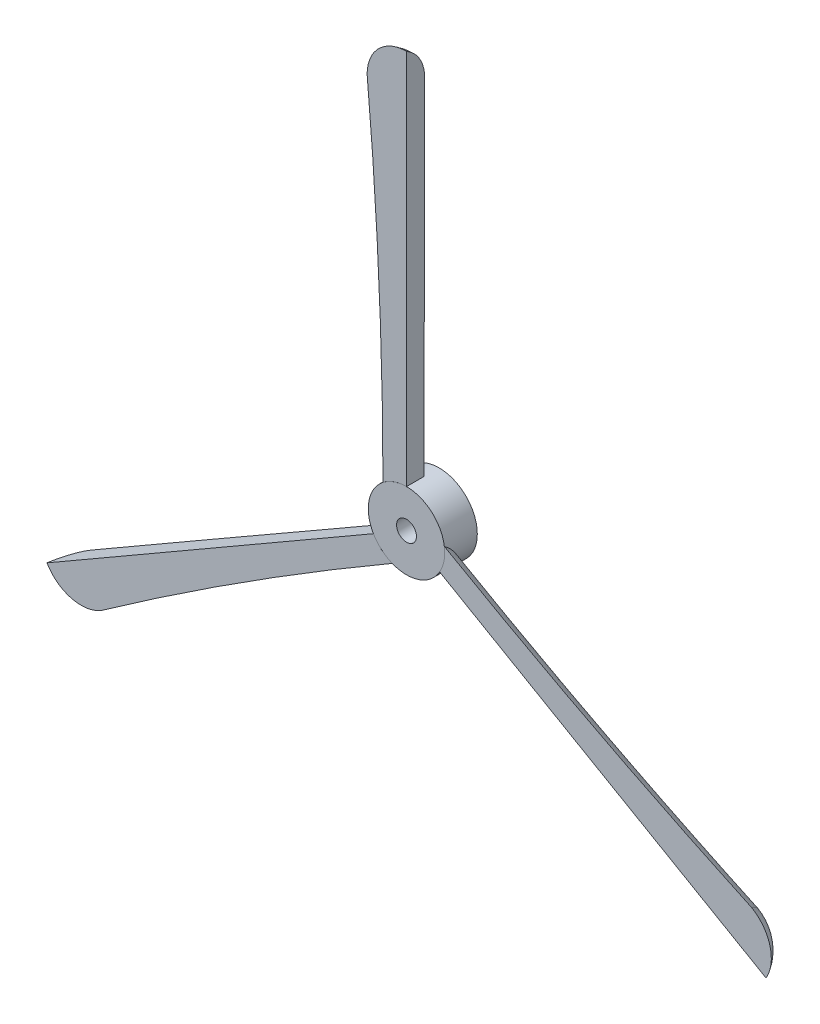
ISO-10303-21;
HEADER;
FILE_DESCRIPTION(('STEP AP214'),'2;1');
FILE_NAME('part.step','',(''),(''),'','','');
FILE_SCHEMA(('AUTOMOTIVE_DESIGN { 1 0 10303 214 1 1 1 1 }'));
ENDSEC;
DATA;
#1=APPLICATION_CONTEXT('core data for automotive mechanical design processes');
#2=APPLICATION_PROTOCOL_DEFINITION('international standard','automotive_design',2000,#1);
#3=PRODUCT_CONTEXT('',#1,'mechanical');
#4=PRODUCT('Part','Part','',(#3));
#5=PRODUCT_RELATED_PRODUCT_CATEGORY('part','',(#4));
#6=PRODUCT_DEFINITION_FORMATION('','',#4);
#7=PRODUCT_DEFINITION_CONTEXT('part definition',#1,'design');
#8=PRODUCT_DEFINITION('design','',#6,#7);
#9=PRODUCT_DEFINITION_SHAPE('','',#8);
#10=(LENGTH_UNIT() NAMED_UNIT(*) SI_UNIT(.MILLI.,.METRE.));
#11=(NAMED_UNIT(*) PLANE_ANGLE_UNIT() SI_UNIT($,.RADIAN.));
#12=(NAMED_UNIT(*) SI_UNIT($,.STERADIAN.) SOLID_ANGLE_UNIT());
#13=UNCERTAINTY_MEASURE_WITH_UNIT(LENGTH_MEASURE(1.E-05),#10,'distance_accuracy_value','');
#14=(GEOMETRIC_REPRESENTATION_CONTEXT(3) GLOBAL_UNCERTAINTY_ASSIGNED_CONTEXT((#13)) GLOBAL_UNIT_ASSIGNED_CONTEXT((#10,
#11,#12)) REPRESENTATION_CONTEXT('',''));
#15=CARTESIAN_POINT('',(0.,0.,0.));
#16=DIRECTION('',(0.,0.,1.));
#17=DIRECTION('',(1.,0.,0.));
#18=AXIS2_PLACEMENT_3D('',#15,#16,#17);
#19=CARTESIAN_POINT('',(0.,0.,4.));
#20=DIRECTION('',(-0.499999999999992,-0.866025403784443,0.));
#21=DIRECTION('',(0.,0.,-1.));
#22=AXIS2_PLACEMENT_3D('',#19,#20,#21);
#23=PLANE('',#22);
#24=DIRECTION('',(0.866025403784443,-0.499999999999992,0.));
#25=VECTOR('',#24,1.);
#26=CARTESIAN_POINT('',(0.,0.,4.));
#27=LINE('',#26,#25);
#28=CARTESIAN_POINT('',(65.1523569172659,-37.6157308045212,4.));
#29=VERTEX_POINT('',#28);
#30=CARTESIAN_POINT('',(91.8764150842648,-53.044872981077,4.));
#31=VERTEX_POINT('',#30);
#32=EDGE_CURVE('E118',#29,#31,#27,.T.);
#33=ORIENTED_EDGE('',*,*,#32,.T.);
#34=CARTESIAN_POINT('',(91.8764150842648,-53.044872981077,14.));
#35=DIRECTION('',(-0.499999999999992,-0.866025403784443,0.));
#36=DIRECTION('',(0.,0.,-1.));
#37=AXIS2_PLACEMENT_3D('',#34,#35,#36);
#38=CIRCLE('',#37,10.);
#39=CARTESIAN_POINT('',(99.3764150842649,-57.3749999999991,9.));
#40=VERTEX_POINT('',#39);
#41=EDGE_CURVE('E66',#31,#40,#38,.T.);
#42=ORIENTED_EDGE('',*,*,#41,.T.);
#43=DIRECTION('',(0.866025403784443,-0.499999999999992,0.));
#44=VECTOR('',#43,1.);
#45=CARTESIAN_POINT('',(0.,0.,9.));
#46=LINE('',#45,#44);
#47=CARTESIAN_POINT('',(9.152088272062,-5.2839606275221,9.));
#48=VERTEX_POINT('',#47);
#49=EDGE_CURVE('E115',#48,#40,#46,.T.);
#50=ORIENTED_EDGE('',*,*,#49,.F.);
#51=DIRECTION('',(0.,0.,1.));
#52=VECTOR('',#51,1.);
#53=CARTESIAN_POINT('',(9.152088272062,-5.2839606275221,4.));
#54=LINE('',#53,#52);
#55=CARTESIAN_POINT('',(9.152088272062,-5.2839606275221,4.23324208766593));
#56=VERTEX_POINT('',#55);
#57=EDGE_CURVE('E122',#56,#48,#54,.T.);
#58=ORIENTED_EDGE('',*,*,#57,.F.);
#59=CARTESIAN_POINT('',(9.152088272062,-5.2839606275221,4.23324208766593));
#60=CARTESIAN_POINT('',(10.5954674638761,-6.11729599245863,4.23208812665062));
#61=CARTESIAN_POINT('',(12.0388460357292,-6.95063099946055,4.2300670543315));
#62=CARTESIAN_POINT('',(14.9256004868418,-8.61729945889474,4.224403935678));
#63=CARTESIAN_POINT('',(16.3689763661018,-9.45063291132732,4.22076188970693));
#64=CARTESIAN_POINT('',(19.2557241084424,-11.1172974974502,4.21197007330051));
#65=CARTESIAN_POINT('',(20.6990959715242,-11.9506286311411,4.20682030340619));
#66=CARTESIAN_POINT('',(23.5858357084713,-13.6172885953479,4.19520280566006));
#67=CARTESIAN_POINT('',(25.0292035823366,-14.4506174258637,4.18873507779009));
#68=CARTESIAN_POINT('',(29.6958788689917,-17.1449236588345,4.16605265027741));
#69=CARTESIAN_POINT('',(32.9191781191645,-19.0058963486005,4.14765392579095));
#70=CARTESIAN_POINT('',(39.3657671703066,-22.7278362726322,4.10895883369531));
#71=CARTESIAN_POINT('',(42.5890569712764,-24.5888035068982,4.08866246621143));
#72=CARTESIAN_POINT('',(47.4240076257717,-27.3802635687895,4.06047666230288));
#73=CARTESIAN_POINT('',(49.0356633019366,-28.3107534072643,4.05145783851708));
#74=CARTESIAN_POINT('',(52.2589798721828,-30.1717360967793,4.03491249033853));
#75=CARTESIAN_POINT('',(53.8706407662617,-31.1022289478181,4.02738596535778));
#76=CARTESIAN_POINT('',(57.0939735059386,-32.9632209727583,4.01461681336839));
#77=CARTESIAN_POINT('',(58.7056453515532,-33.8937201466692,4.0093741915727));
#78=CARTESIAN_POINT('',(61.9289965869679,-35.7547228501286,4.00207350693363));
#79=CARTESIAN_POINT('',(63.5406759767756,-36.6852263796814,4.00001544874754));
#80=CARTESIAN_POINT('',(65.1523569172659,-37.6157308045213,4.));
#81=B_SPLINE_CURVE_WITH_KNOTS('',3,(#59,#60,#61,#62,#63,#64,#65,#66,#67,#68,#69,#70,#71,#72,#73,
#74,#75,#76,#77,#78,#79,#80),.UNSPECIFIED.,.F.,.F.,(4,2,2,2,2,2,2,2,2,2,4),(0.,5.00001299800278,
10.0000248753014,15.0000349583489,20.0000451102266,31.1660154591632,42.3319850707985,
47.9149892699279,53.4979912691934,59.0810060114387,64.6640289186212),.UNSPECIFIED.);
#82=EDGE_CURVE('E126',#56,#29,#81,.T.);
#83=ORIENTED_EDGE('',*,*,#82,.T.);
#84=EDGE_LOOP('',(#33,#42,#50,#58,#83));
#85=FACE_BOUND('',#84,.T.);
#86=ADVANCED_FACE('F52',(#85),#23,.T.);
#87=CARTESIAN_POINT('',(0.,0.,4.));
#88=DIRECTION('',(0.,0.,1.));
#89=DIRECTION('',(-0.499999999999992,-0.866025403784443,0.));
#90=AXIS2_PLACEMENT_3D('',#87,#88,#89);
#91=CYLINDRICAL_SURFACE('',#90,10.5679212550444);
#92=CARTESIAN_POINT('',(0.,0.,9.));
#93=DIRECTION('',(0.,0.,1.));
#94=DIRECTION('',(-0.499999999999992,-0.866025403784443,0.));
#95=AXIS2_PLACEMENT_3D('',#92,#93,#94);
#96=CIRCLE('',#95,10.5679212550444);
#97=CARTESIAN_POINT('',(10.4647183992984,1.47330528954556,9.));
#98=VERTEX_POINT('',#97);
#99=EDGE_CURVE('E110',#48,#98,#96,.T.);
#100=ORIENTED_EDGE('',*,*,#99,.T.);
#101=CARTESIAN_POINT('',(10.4647183992984,1.47330528954556,9.));
#102=CARTESIAN_POINT('',(10.4772068265116,1.38461057903331,8.87767671407899));
#103=CARTESIAN_POINT('',(10.4888786306254,1.29352827575395,8.75702498326268));
#104=CARTESIAN_POINT('',(10.5102177319619,1.1068447304787,8.51908646485478));
#105=CARTESIAN_POINT('',(10.5198850259529,1.01124348119761,8.40179968268847));
#106=CARTESIAN_POINT('',(10.545333905741,0.717922648063707,8.05487404754202));
#107=CARTESIAN_POINT('',(10.5575457708955,0.513798683854439,7.83032451242971));
#108=CARTESIAN_POINT('',(10.5697164102885,0.0883942893414073,7.39336570220923));
#109=CARTESIAN_POINT('',(10.5695511458919,-0.13303759287408,7.18110066608649));
#110=CARTESIAN_POINT('',(10.5539430689205,-0.589340995017446,6.7722349673859));
#111=CARTESIAN_POINT('',(10.5385062286497,-0.824207227301471,6.57562821374987));
#112=CARTESIAN_POINT('',(10.4940428567885,-1.26325742614638,6.23243674624884));
#113=CARTESIAN_POINT('',(10.4678728377253,-1.46560290277407,6.08312477687204));
#114=CARTESIAN_POINT('',(10.4019953573406,-1.87691712432631,5.79705696001114));
#115=CARTESIAN_POINT('',(10.3622876193428,-2.08588600453707,5.66030136921972));
#116=CARTESIAN_POINT('',(10.2683365102039,-2.50771696402272,5.40127423499538));
#117=CARTESIAN_POINT('',(10.214180750162,-2.72054860041248,5.27892159432284));
#118=CARTESIAN_POINT('',(10.0901408235776,-3.14957610607928,5.04900962458501));
#119=CARTESIAN_POINT('',(10.0202617558803,-3.3657708636344,4.94144551798515));
#120=CARTESIAN_POINT('',(9.89098124313928,-3.72454386502421,4.77675216628645));
#121=CARTESIAN_POINT('',(9.83630326876818,-3.86674536853299,4.71503889959368));
#122=CARTESIAN_POINT('',(9.71972172122324,-4.15109256986937,4.59880000559343));
#123=CARTESIAN_POINT('',(9.65782007292833,-4.29323827248241,4.54427247172583));
#124=CARTESIAN_POINT('',(9.52630631954748,-4.57767677653495,4.44239111132145));
#125=CARTESIAN_POINT('',(9.45665038163282,-4.71996538825645,4.3950820637944));
#126=CARTESIAN_POINT('',(9.30992149788299,-5.00318320591918,4.30825020040899));
#127=CARTESIAN_POINT('',(9.23284475674628,-5.14411167525451,4.26873140062563));
#128=CARTESIAN_POINT('',(9.15208827206201,-5.28396062752207,4.23324208766587));
#129=B_SPLINE_CURVE_WITH_KNOTS('',3,(#101,#102,#103,#104,#105,#106,#107,#108,#109,#110,#111,
#112,#113,#114,#115,#116,#117,#118,#119,#120,#121,#122,#123,#124,#125,#126,#127,#128),
.UNSPECIFIED.,.F.,.F.,(4,2,2,2,2,2,2,2,2,2,2,2,2,4),(0.,0.454764260886536,0.909529254945333,
1.81963381048955,2.73886027805805,3.65772740284461,4.41552369004862,5.17333546559458,
5.92665248430483,6.67972556419344,7.17257191329865,7.66528723315118,8.16094460288619,
8.65685683243503),.UNSPECIFIED.);
#130=EDGE_CURVE('E12',#98,#56,#129,.T.);
#131=ORIENTED_EDGE('',*,*,#130,.T.);
#132=ORIENTED_EDGE('',*,*,#57,.T.);
#133=EDGE_LOOP('',(#100,#131,#132));
#134=FACE_BOUND('',#133,.T.);
#135=ADVANCED_FACE('F138',(#134),#91,.F.);
#136=CARTESIAN_POINT('',(0.,0.,4.));
#137=DIRECTION('',(0.,0.,1.));
#138=DIRECTION('',(-0.499999999999992,-0.866025403784443,0.));
#139=AXIS2_PLACEMENT_3D('',#136,#137,#138);
#140=PLANE('',#139);
#141=CARTESIAN_POINT('',(543.942700327921,927.833916149742,4.));
#142=DIRECTION('',(0.,0.,1.));
#143=DIRECTION('',(-0.499999999999992,-0.866025403784443,0.));
#144=AXIS2_PLACEMENT_3D('',#141,#142,#143);
#145=CIRCLE('',#144,1077.65171263605);
#146=CARTESIAN_POINT('',(91.2612271282953,-50.1296299853994,4.));
#147=VERTEX_POINT('',#146);
#148=EDGE_CURVE('E79',#29,#147,#145,.T.);
#149=ORIENTED_EDGE('',*,*,#148,.T.);
#150=CARTESIAN_POINT('',(89.9451873513345,-51.9298781296032,4.));
#151=DIRECTION('',(0.,0.,1.));
#152=DIRECTION('',(-0.499999999999992,-0.866025403784443,0.));
#153=AXIS2_PLACEMENT_3D('',#150,#151,#152);
#154=CIRCLE('',#153,2.22998970294755);
#155=EDGE_CURVE('E102',#147,#31,#154,.F.);
#156=ORIENTED_EDGE('',*,*,#155,.T.);
#157=ORIENTED_EDGE('',*,*,#32,.F.);
#158=EDGE_LOOP('',(#149,#156,#157));
#159=FACE_BOUND('',#158,.T.);
#160=ADVANCED_FACE('F147',(#159),#140,.F.);
#161=CARTESIAN_POINT('',(0.,0.,9.));
#162=DIRECTION('',(0.,0.,1.));
#163=DIRECTION('',(-0.499999999999992,-0.866025403784443,0.));
#164=AXIS2_PLACEMENT_3D('',#161,#162,#163);
#165=PLANE('',#164);
#166=CARTESIAN_POINT('',(89.9451873513345,-51.9298781296032,9.));
#167=DIRECTION('',(0.,0.,1.));
#168=DIRECTION('',(-0.499999999999992,-0.866025403784443,0.));
#169=AXIS2_PLACEMENT_3D('',#166,#167,#168);
#170=CIRCLE('',#169,10.8902437407919);
#171=CARTESIAN_POINT('',(95.3822148700475,-42.4939817495757,9.));
#172=VERTEX_POINT('',#171);
#173=EDGE_CURVE('E101',#40,#172,#170,.T.);
#174=ORIENTED_EDGE('',*,*,#173,.T.);
#175=CARTESIAN_POINT('',(543.942700327921,927.833916149742,9.));
#176=DIRECTION('',(0.,0.,1.));
#177=DIRECTION('',(-0.499999999999992,-0.866025403784443,0.));
#178=AXIS2_PLACEMENT_3D('',#175,#176,#177);
#179=CIRCLE('',#178,1068.9914585982);
#180=EDGE_CURVE('E105',#172,#98,#179,.F.);
#181=ORIENTED_EDGE('',*,*,#180,.T.);
#182=ORIENTED_EDGE('',*,*,#99,.F.);
#183=ORIENTED_EDGE('',*,*,#49,.T.);
#184=EDGE_LOOP('',(#174,#181,#182,#183));
#185=FACE_BOUND('',#184,.T.);
#186=ADVANCED_FACE('F113',(#185),#165,.T.);
#187=CARTESIAN_POINT('',(543.942700327921,927.833916149742,14.));
#188=DIRECTION('',(0.,0.,1.));
#189=DIRECTION('',(-0.499999999999992,-0.866025403784443,0.));
#190=AXIS2_PLACEMENT_3D('',#187,#188,#189);
#191=TOROIDAL_SURFACE('',#190,1077.65171263605,10.);
#192=ORIENTED_EDGE('',*,*,#130,.F.);
#193=ORIENTED_EDGE('',*,*,#180,.F.);
#194=CARTESIAN_POINT('',(95.3822148700475,-42.4939817495757,9.));
#195=CARTESIAN_POINT('',(95.3108989938501,-42.6316718739632,8.73160289977827));
#196=CARTESIAN_POINT('',(95.2337472046003,-42.7804808934664,8.47047025119086));
#197=CARTESIAN_POINT('',(95.0684205546519,-43.098855562409,7.96487110722592));
#198=CARTESIAN_POINT('',(94.9802454849489,-43.268421605406,7.72040492798515));
#199=CARTESIAN_POINT('',(94.7937527033861,-43.6263844257354,7.25086267925941));
#200=CARTESIAN_POINT('',(94.6954603913925,-43.814734010676,7.02574053507794));
#201=CARTESIAN_POINT('',(94.4892951693264,-44.2088960337502,6.59615939917471));
#202=CARTESIAN_POINT('',(94.3814234395505,-44.4147063203813,6.39169786844127));
#203=CARTESIAN_POINT('',(94.1670997532954,-44.8224994529995,6.02276126640526));
#204=CARTESIAN_POINT('',(94.0614110964438,-45.023127733907,5.85634069349968));
#205=CARTESIAN_POINT('',(93.8433763078975,-45.4357969442956,5.5431676911415));
#206=CARTESIAN_POINT('',(93.7310302823332,-45.6478376918364,5.3964149482699));
#207=CARTESIAN_POINT('',(93.5002527837902,-46.081851840821,5.12353905664158));
#208=CARTESIAN_POINT('',(93.3818179871453,-46.3038306584162,4.99742733571265));
#209=CARTESIAN_POINT('',(93.1395582861941,-46.7559132462422,4.76681889462885));
#210=CARTESIAN_POINT('',(93.0157335951233,-46.9860166949777,4.66232132031242));
#211=CARTESIAN_POINT('',(92.7638638202652,-47.4515281916737,4.47607954936247));
#212=CARTESIAN_POINT('',(92.6358400261391,-47.6869079989688,4.39423593637854));
#213=CARTESIAN_POINT('',(92.3755911154198,-48.1620943948559,4.2532457231008));
#214=CARTESIAN_POINT('',(92.2433661699109,-48.4019008030162,4.19409819982827));
#215=CARTESIAN_POINT('',(91.9754399068468,-48.8833614051491,4.09899800408775));
#216=CARTESIAN_POINT('',(91.8397476581782,-49.1250098094164,4.06299020547932));
#217=CARTESIAN_POINT('',(91.5647637592324,-49.6084547191805,4.01417377933688));
#218=CARTESIAN_POINT('',(91.4254747808844,-49.8502509914629,4.00134840597009));
#219=CARTESIAN_POINT('',(91.2764897847047,-50.1037073052,4.00003355594432));
#220=CARTESIAN_POINT('',(91.2688614888627,-50.1166706605125,3.99999994728489));
#221=CARTESIAN_POINT('',(91.2612271282953,-50.1296299853994,4.));
#222=B_SPLINE_CURVE_WITH_KNOTS('',3,(#194,#195,#196,#197,#198,#199,#200,#201,#202,#203,#204,
#205,#206,#207,#208,#209,#210,#211,#212,#213,#214,#215,#216,#217,#218,#219,#220,#221),
.UNSPECIFIED.,.F.,.F.,(4,2,2,2,2,2,2,2,2,2,2,2,2,4),(0.,0.929565317697032,1.859148262886,
2.7864518731275,3.71364138678522,4.55649671955107,5.39933861930026,6.24264558842751,
7.08591922484495,7.92543128465569,8.76490920052776,9.60237972716184,10.4392450645515,
10.4843687744743),.UNSPECIFIED.);
#223=EDGE_CURVE('E57',#147,#172,#222,.F.);
#224=ORIENTED_EDGE('',*,*,#223,.F.);
#225=ORIENTED_EDGE('',*,*,#148,.F.);
#226=ORIENTED_EDGE('',*,*,#82,.F.);
#227=EDGE_LOOP('',(#192,#193,#224,#225,#226));
#228=FACE_BOUND('',#227,.T.);
#229=ADVANCED_FACE('F106',(#228),#191,.T.);
#230=CARTESIAN_POINT('',(89.9451873513345,-51.9298781296032,14.));
#231=DIRECTION('',(0.,0.,-1.));
#232=DIRECTION('',(0.499999999999992,0.866025403784443,0.));
#233=AXIS2_PLACEMENT_3D('',#230,#231,#232);
#234=DEGENERATE_TOROIDAL_SURFACE('',#233,2.22998970294755,10.,.T.);
#235=ORIENTED_EDGE('',*,*,#41,.F.);
#236=ORIENTED_EDGE('',*,*,#155,.F.);
#237=ORIENTED_EDGE('',*,*,#223,.T.);
#238=ORIENTED_EDGE('',*,*,#173,.F.);
#239=EDGE_LOOP('',(#235,#236,#237,#238));
#240=FACE_BOUND('',#239,.T.);
#241=ADVANCED_FACE('F54',(#240),#234,.T.);
#242=CLOSED_SHELL('',(#86,#135,#160,#186,#229,#241));
#243=MANIFOLD_SOLID_BREP('B2',#242);
#244=CARTESIAN_POINT('',(0.,0.,4.));
#245=DIRECTION('',(-0.500000000000004,0.866025403784436,0.));
#246=DIRECTION('',(0.,0.,-1.));
#247=AXIS2_PLACEMENT_3D('',#244,#245,#246);
#248=PLANE('',#247);
#249=DIRECTION('',(-0.866025403784436,-0.500000000000004,0.));
#250=VECTOR('',#249,1.);
#251=CARTESIAN_POINT('',(0.,0.,4.));
#252=LINE('',#251,#250);
#253=CARTESIAN_POINT('',(-65.1523569172654,-37.6157308045222,4.));
#254=VERTEX_POINT('',#253);
#255=CARTESIAN_POINT('',(-91.8764150842641,-53.0448729810782,4.));
#256=VERTEX_POINT('',#255);
#257=EDGE_CURVE('E261',#254,#256,#252,.T.);
#258=ORIENTED_EDGE('',*,*,#257,.T.);
#259=CARTESIAN_POINT('',(-91.8764150842641,-53.0448729810782,14.));
#260=DIRECTION('',(-0.500000000000004,0.866025403784436,0.));
#261=DIRECTION('',(0.,0.,-1.));
#262=AXIS2_PLACEMENT_3D('',#259,#260,#261);
#263=CIRCLE('',#262,10.);
#264=CARTESIAN_POINT('',(-99.3764150842641,-57.3750000000005,9.));
#265=VERTEX_POINT('',#264);
#266=EDGE_CURVE('E209',#256,#265,#263,.T.);
#267=ORIENTED_EDGE('',*,*,#266,.T.);
#268=DIRECTION('',(-0.866025403784436,-0.500000000000004,0.));
#269=VECTOR('',#268,1.);
#270=CARTESIAN_POINT('',(0.,0.,9.));
#271=LINE('',#270,#269);
#272=CARTESIAN_POINT('',(-9.15208827206192,-5.28396062752222,9.));
#273=VERTEX_POINT('',#272);
#274=EDGE_CURVE('E258',#273,#265,#271,.T.);
#275=ORIENTED_EDGE('',*,*,#274,.F.);
#276=DIRECTION('',(0.,0.,1.));
#277=VECTOR('',#276,1.);
#278=CARTESIAN_POINT('',(-9.15208827206192,-5.28396062752222,4.));
#279=LINE('',#278,#277);
#280=CARTESIAN_POINT('',(-9.15208827206192,-5.28396062752222,4.23324208766593));
#281=VERTEX_POINT('',#280);
#282=EDGE_CURVE('E265',#281,#273,#279,.T.);
#283=ORIENTED_EDGE('',*,*,#282,.F.);
#284=CARTESIAN_POINT('',(-9.15208827206192,-5.28396062752222,4.23324208766593));
#285=CARTESIAN_POINT('',(-10.595467463876,-6.11729599245878,4.23208812665055));
#286=CARTESIAN_POINT('',(-12.0388460357291,-6.95063099946072,4.23006705433144));
#287=CARTESIAN_POINT('',(-14.9256004868417,-8.61729945889495,4.22440393567797));
#288=CARTESIAN_POINT('',(-16.3689763661017,-9.45063291132755,4.22076188970694));
#289=CARTESIAN_POINT('',(-19.2557241084423,-11.1172974974504,4.21197007330051));
#290=CARTESIAN_POINT('',(-20.699095971524,-11.9506286311414,4.20682030340615));
#291=CARTESIAN_POINT('',(-23.5858357084712,-13.6172885953483,4.19520280566001));
#292=CARTESIAN_POINT('',(-25.0292035823364,-14.450617425864,4.18873507779008));
#293=CARTESIAN_POINT('',(-29.6958788689914,-17.1449236588349,4.16605265027744));
#294=CARTESIAN_POINT('',(-32.9191781191643,-19.0058963486009,4.14765392579092));
#295=CARTESIAN_POINT('',(-39.3657671703063,-22.7278362726327,4.10895883369526));
#296=CARTESIAN_POINT('',(-42.5890569712761,-24.5888035068988,4.08866246621144));
#297=CARTESIAN_POINT('',(-47.4240076257713,-27.3802635687902,4.06047666230288));
#298=CARTESIAN_POINT('',(-49.0356633019362,-28.310753407265,4.05145783851706));
#299=CARTESIAN_POINT('',(-52.2589798721823,-30.17173609678,4.03491249033851));
#300=CARTESIAN_POINT('',(-53.8706407662613,-31.1022289478189,4.02738596535777));
#301=CARTESIAN_POINT('',(-57.0939735059381,-32.9632209727591,4.01461681336839));
#302=CARTESIAN_POINT('',(-58.7056453515527,-33.89372014667,4.0093741915727));
#303=CARTESIAN_POINT('',(-61.9289965869674,-35.7547228501294,4.00207350693362));
#304=CARTESIAN_POINT('',(-63.5406759767751,-36.6852263796823,4.00001544874753));
#305=CARTESIAN_POINT('',(-65.1523569172654,-37.6157308045222,4.));
#306=B_SPLINE_CURVE_WITH_KNOTS('',3,(#284,#285,#286,#287,#288,#289,#290,#291,#292,#293,#294,
#295,#296,#297,#298,#299,#300,#301,#302,#303,#304,#305),.UNSPECIFIED.,.F.,.F.,(4,2,2,2,2,2,2,2,
2,2,4),(0.,5.00001299800278,10.0000248753014,15.0000349583489,20.0000451102266,31.1660154591632,
42.3319850707985,47.9149892699279,53.4979912691934,59.0810060114387,64.6640289186212),.UNSPECIFIED.);
#307=EDGE_CURVE('E269',#281,#254,#306,.T.);
#308=ORIENTED_EDGE('',*,*,#307,.T.);
#309=EDGE_LOOP('',(#258,#267,#275,#283,#308));
#310=FACE_BOUND('',#309,.T.);
#311=ADVANCED_FACE('F195',(#310),#248,.T.);
#312=CARTESIAN_POINT('',(0.,0.,4.));
#313=DIRECTION('',(0.,0.,1.));
#314=DIRECTION('',(-0.500000000000004,0.866025403784436,0.));
#315=AXIS2_PLACEMENT_3D('',#312,#313,#314);
#316=CYLINDRICAL_SURFACE('',#315,10.5679212550444);
#317=CARTESIAN_POINT('',(0.,0.,9.));
#318=DIRECTION('',(0.,0.,1.));
#319=DIRECTION('',(-0.500000000000004,0.866025403784436,0.));
#320=AXIS2_PLACEMENT_3D('',#317,#318,#319);
#321=CIRCLE('',#320,10.5679212550444);
#322=CARTESIAN_POINT('',(-3.95643939137282,-9.79936462201565,9.));
#323=VERTEX_POINT('',#322);
#324=EDGE_CURVE('E253',#273,#323,#321,.T.);
#325=ORIENTED_EDGE('',*,*,#324,.T.);
#326=CARTESIAN_POINT('',(-3.95643939137282,-9.79936462201565,9.));
#327=CARTESIAN_POINT('',(-4.03949547746421,-9.76583256197952,8.87767671407887));
#328=CARTESIAN_POINT('',(-4.1242109679962,-9.73039948921037,8.75702498326254));
#329=CARTESIAN_POINT('',(-4.29655321134139,-9.65553792042406,8.51908646485466));
#330=CARTESIAN_POINT('',(-4.38417996884791,-9.61610941796556,8.40179968268839));
#331=CARTESIAN_POINT('',(-4.65092770169518,-9.49148837779295,8.05487404754196));
#332=CARTESIAN_POINT('',(-4.83381017279866,-9.40000218113972,7.83032451242952));
#333=CARTESIAN_POINT('',(-5.20830650502497,-9.1978400667779,7.39336570220902));
#334=CARTESIAN_POINT('',(-5.39998950803319,-9.08698100250431,7.1811006660864));
#335=CARTESIAN_POINT('',(-5.78735580763703,-8.84531231027112,6.77223496738594));
#336=CARTESIAN_POINT('',(-5.98303751115073,-8.71451049830041,6.57562821374992));
#337=CARTESIAN_POINT('',(-6.34103445095638,-8.45647898930826,6.2324367462488));
#338=CARTESIAN_POINT('',(-6.50318576452522,-8.33264234966822,6.08312477687194));
#339=CARTESIAN_POINT('',(-6.82645558913489,-8.06993366734164,5.79705696001098));
#340=CARTESIAN_POINT('',(-6.98757407899889,-7.9310613174033,5.66030136921959));
#341=CARTESIAN_POINT('',(-7.30591485144679,-7.63878179043248,5.40127423499525));
#342=CARTESIAN_POINT('',(-7.46315457526837,-7.48546570828004,5.2789215943227));
#343=CARTESIAN_POINT('',(-7.77268333080593,-7.163530227941,5.04900962458494));
#344=CARTESIAN_POINT('',(-7.92497394916507,-6.99491580134479,4.94144551798516));
#345=CARTESIAN_POINT('',(-8.17104022619012,-6.70356909240186,4.77675216628644));
#346=CARTESIAN_POINT('',(-8.2668513534995,-6.58511582581464,4.71503889959362));
#347=CARTESIAN_POINT('',(-8.45481247957934,-6.34197964336003,4.59880000559334));
#348=CARTESIAN_POINT('',(-8.54696344493356,-6.21729839209399,4.54427247172576));
#349=CARTESIAN_POINT('',(-8.72753753856709,-5.96118488869286,4.44239111132139));
#350=CARTESIAN_POINT('',(-8.81593512202979,-5.82971677107358,4.39508206379434));
#351=CARTESIAN_POINT('',(-8.98784450505519,-5.56103692144592,4.30825020040893));
#352=CARTESIAN_POINT('',(-9.07135376904769,-5.42382227091295,4.26873140062559));
#353=CARTESIAN_POINT('',(-9.15208827206191,-5.28396062752225,4.23324208766587));
#354=B_SPLINE_CURVE_WITH_KNOTS('',3,(#326,#327,#328,#329,#330,#331,#332,#333,#334,#335,#336,
#337,#338,#339,#340,#341,#342,#343,#344,#345,#346,#347,#348,#349,#350,#351,#352,#353),
.UNSPECIFIED.,.F.,.F.,(4,2,2,2,2,2,2,2,2,2,2,2,2,4),(0.,0.45476426088655,0.909529254945375,
1.81963381048957,2.73886027805806,3.65772740284464,4.41552369004867,5.17333546559463,
5.92665248430488,6.6797255641935,7.17257191329872,7.66528723315124,8.16094460288626,
8.6568568324351),.UNSPECIFIED.);
#355=EDGE_CURVE('E50',#323,#281,#354,.T.);
#356=ORIENTED_EDGE('',*,*,#355,.T.);
#357=ORIENTED_EDGE('',*,*,#282,.T.);
#358=EDGE_LOOP('',(#325,#356,#357));
#359=FACE_BOUND('',#358,.T.);
#360=ADVANCED_FACE('F281',(#359),#316,.F.);
#361=CARTESIAN_POINT('',(0.,0.,4.));
#362=DIRECTION('',(0.,0.,1.));
#363=DIRECTION('',(-0.500000000000004,0.866025403784436,0.));
#364=AXIS2_PLACEMENT_3D('',#361,#362,#363);
#365=PLANE('',#364);
#366=CARTESIAN_POINT('',(531.556391714513,-934.98515476196,4.));
#367=DIRECTION('',(0.,0.,1.));
#368=DIRECTION('',(-0.500000000000004,0.866025403784436,0.));
#369=AXIS2_PLACEMENT_3D('',#366,#367,#368);
#370=CIRCLE('',#369,1077.65171263605);
#371=CARTESIAN_POINT('',(-89.0441466138179,-53.9697260809452,4.));
#372=VERTEX_POINT('',#371);
#373=EDGE_CURVE('E222',#254,#372,#370,.T.);
#374=ORIENTED_EDGE('',*,*,#373,.T.);
#375=CARTESIAN_POINT('',(-89.9451873513338,-51.9298781296045,4.));
#376=DIRECTION('',(0.,0.,1.));
#377=DIRECTION('',(-0.500000000000004,0.866025403784436,0.));
#378=AXIS2_PLACEMENT_3D('',#375,#376,#377);
#379=CIRCLE('',#378,2.22998970294755);
#380=EDGE_CURVE('E245',#372,#256,#379,.F.);
#381=ORIENTED_EDGE('',*,*,#380,.T.);
#382=ORIENTED_EDGE('',*,*,#257,.F.);
#383=EDGE_LOOP('',(#374,#381,#382));
#384=FACE_BOUND('',#383,.T.);
#385=ADVANCED_FACE('F290',(#384),#365,.F.);
#386=CARTESIAN_POINT('',(0.,0.,9.));
#387=DIRECTION('',(0.,0.,1.));
#388=DIRECTION('',(-0.500000000000004,0.866025403784436,0.));
#389=AXIS2_PLACEMENT_3D('',#386,#387,#388);
#390=PLANE('',#389);
#391=CARTESIAN_POINT('',(-89.9451873513338,-51.9298781296045,9.));
#392=DIRECTION('',(0.,0.,1.));
#393=DIRECTION('',(-0.500000000000004,0.866025403784436,0.));
#394=AXIS2_PLACEMENT_3D('',#391,#392,#393);
#395=CIRCLE('',#394,10.8902437407919);
#396=CARTESIAN_POINT('',(-84.491975138109,-61.3564302718988,9.));
#397=VERTEX_POINT('',#396);
#398=EDGE_CURVE('E244',#265,#397,#395,.T.);
#399=ORIENTED_EDGE('',*,*,#398,.T.);
#400=CARTESIAN_POINT('',(531.556391714513,-934.98515476196,9.));
#401=DIRECTION('',(0.,0.,1.));
#402=DIRECTION('',(-0.500000000000004,0.866025403784436,0.));
#403=AXIS2_PLACEMENT_3D('',#400,#401,#402);
#404=CIRCLE('',#403,1068.9914585982);
#405=EDGE_CURVE('E248',#397,#323,#404,.F.);
#406=ORIENTED_EDGE('',*,*,#405,.T.);
#407=ORIENTED_EDGE('',*,*,#324,.F.);
#408=ORIENTED_EDGE('',*,*,#274,.T.);
#409=EDGE_LOOP('',(#399,#406,#407,#408));
#410=FACE_BOUND('',#409,.T.);
#411=ADVANCED_FACE('F256',(#410),#390,.T.);
#412=CARTESIAN_POINT('',(531.556391714513,-934.98515476196,14.));
#413=DIRECTION('',(0.,0.,1.));
#414=DIRECTION('',(-0.500000000000004,0.866025403784436,0.));
#415=AXIS2_PLACEMENT_3D('',#412,#413,#414);
#416=TOROIDAL_SURFACE('',#415,1077.65171263605,10.);
#417=ORIENTED_EDGE('',*,*,#355,.F.);
#418=ORIENTED_EDGE('',*,*,#405,.F.);
#419=CARTESIAN_POINT('',(-84.491975138109,-61.3564302718988,9.));
#420=CARTESIAN_POINT('',(-84.5755603455785,-61.225823849224,8.73160289977823));
#421=CARTESIAN_POINT('',(-84.6658568421554,-61.0846039300344,8.47047025119082));
#422=CARTESIAN_POINT('',(-84.8589140684069,-60.7822395167853,7.96487110722588));
#423=CARTESIAN_POINT('',(-84.9616750344103,-60.6210946449437,7.72040492798512));
#424=CARTESIAN_POINT('',(-85.1784335396439,-60.2806057483228,7.25086267925936));
#425=CARTESIAN_POINT('',(-85.2924029089971,-60.1013073166689,7.02574053507787));
#426=CARTESIAN_POINT('',(-85.5306746231543,-59.7256819854462,6.59615939917466));
#427=CARTESIAN_POINT('',(-85.6549756948509,-59.5293571837957,6.39169786844127));
#428=CARTESIAN_POINT('',(-85.9009730640598,-59.1398508605571,6.02276126640525));
#429=CARTESIAN_POINT('',(-86.021877923616,-58.9480076583771,5.85634069349963));
#430=CARTESIAN_POINT('',(-86.2702425488982,-58.5528493873924,5.54316769114143));
#431=CARTESIAN_POINT('',(-86.3977022101244,-58.3495345014695,5.39641494826986));
#432=CARTESIAN_POINT('',(-86.6581807394753,-57.932668250617,5.12353905664153));
#433=CARTESIAN_POINT('',(-86.7912026362917,-57.7191112992325,4.99742733571259));
#434=CARTESIAN_POINT('',(-87.0615877914826,-57.2832669499829,4.7668188946288));
#435=CARTESIAN_POINT('',(-87.1989508780518,-57.0609798975328,4.66232132031241));
#436=CARTESIAN_POINT('',(-87.4761607725162,-56.6100985257129,4.47607954936248));
#437=CARTESIAN_POINT('',(-87.6159937681083,-56.3815367640631,4.39423593637855));
#438=CARTESIAN_POINT('',(-87.897392803119,-55.918561398129,4.2532457231008));
#439=CARTESIAN_POINT('',(-88.0389587718214,-55.684148032224,4.19409819982826));
#440=CARTESIAN_POINT('',(-88.3219527526577,-55.211386781003,4.09899800408774));
#441=CARTESIAN_POINT('',(-88.4633802852033,-54.9730496444259,4.06299020547931));
#442=CARTESIAN_POINT('',(-88.7445639089168,-54.4931841474253,4.01417377933688));
#443=CARTESIAN_POINT('',(-88.8843211340796,-54.2516582175676,4.00134840597009));
#444=CARTESIAN_POINT('',(-89.0293282424358,-53.9959052692247,4.00003355594432));
#445=CARTESIAN_POINT('',(-89.0367406895337,-53.9828172935817,3.99999994728489));
#446=CARTESIAN_POINT('',(-89.0441466138179,-53.9697260809452,4.));
#447=B_SPLINE_CURVE_WITH_KNOTS('',3,(#419,#420,#421,#422,#423,#424,#425,#426,#427,#428,#429,
#430,#431,#432,#433,#434,#435,#436,#437,#438,#439,#440,#441,#442,#443,#444,#445,#446),
.UNSPECIFIED.,.F.,.F.,(4,2,2,2,2,2,2,2,2,2,2,2,2,4),(0.,0.929565317697031,1.859148262886,
2.7864518731275,3.71364138678524,4.55649671955109,5.39933861930029,6.24264558842753,
7.08591922484496,7.92543128465569,8.76490920052776,9.60237972716185,10.4392450645515,
10.4843687744742),.UNSPECIFIED.);
#448=EDGE_CURVE('E200',#372,#397,#447,.F.);
#449=ORIENTED_EDGE('',*,*,#448,.F.);
#450=ORIENTED_EDGE('',*,*,#373,.F.);
#451=ORIENTED_EDGE('',*,*,#307,.F.);
#452=EDGE_LOOP('',(#417,#418,#449,#450,#451));
#453=FACE_BOUND('',#452,.T.);
#454=ADVANCED_FACE('F249',(#453),#416,.T.);
#455=CARTESIAN_POINT('',(-89.9451873513338,-51.9298781296045,14.));
#456=DIRECTION('',(0.,0.,-1.));
#457=DIRECTION('',(0.500000000000004,-0.866025403784436,0.));
#458=AXIS2_PLACEMENT_3D('',#455,#456,#457);
#459=DEGENERATE_TOROIDAL_SURFACE('',#458,2.22998970294755,10.,.T.);
#460=ORIENTED_EDGE('',*,*,#266,.F.);
#461=ORIENTED_EDGE('',*,*,#380,.F.);
#462=ORIENTED_EDGE('',*,*,#448,.T.);
#463=ORIENTED_EDGE('',*,*,#398,.F.);
#464=EDGE_LOOP('',(#460,#461,#462,#463));
#465=FACE_BOUND('',#464,.T.);
#466=ADVANCED_FACE('F197',(#465),#459,.T.);
#467=CLOSED_SHELL('',(#311,#360,#385,#411,#454,#466));
#468=MANIFOLD_SOLID_BREP('B6',#467);
#469=CARTESIAN_POINT('',(0.,0.,4.));
#470=DIRECTION('',(1.,0.,0.));
#471=DIRECTION('',(0.,0.,-1.));
#472=AXIS2_PLACEMENT_3D('',#469,#470,#471);
#473=PLANE('',#472);
#474=DIRECTION('',(0.,1.,0.));
#475=VECTOR('',#474,1.);
#476=CARTESIAN_POINT('',(0.,0.,4.));
#477=LINE('',#476,#475);
#478=CARTESIAN_POINT('',(0.,75.2314616090437,4.));
#479=VERTEX_POINT('',#478);
#480=CARTESIAN_POINT('',(0.,106.089745962156,4.));
#481=VERTEX_POINT('',#480);
#482=EDGE_CURVE('E401',#479,#481,#477,.T.);
#483=ORIENTED_EDGE('',*,*,#482,.T.);
#484=CARTESIAN_POINT('',(0.,106.089745962156,14.));
#485=DIRECTION('',(1.,0.,0.));
#486=DIRECTION('',(0.,0.,-1.));
#487=AXIS2_PLACEMENT_3D('',#484,#485,#486);
#488=CIRCLE('',#487,10.);
#489=CARTESIAN_POINT('',(0.,114.75,9.));
#490=VERTEX_POINT('',#489);
#491=EDGE_CURVE('E349',#481,#490,#488,.T.);
#492=ORIENTED_EDGE('',*,*,#491,.T.);
#493=DIRECTION('',(0.,1.,0.));
#494=VECTOR('',#493,1.);
#495=CARTESIAN_POINT('',(0.,0.,9.));
#496=LINE('',#495,#494);
#497=CARTESIAN_POINT('',(0.,10.5679212550444,9.));
#498=VERTEX_POINT('',#497);
#499=EDGE_CURVE('E398',#498,#490,#496,.T.);
#500=ORIENTED_EDGE('',*,*,#499,.F.);
#501=DIRECTION('',(0.,0.,1.));
#502=VECTOR('',#501,1.);
#503=CARTESIAN_POINT('',(0.,10.5679212550444,4.));
#504=LINE('',#503,#502);
#505=CARTESIAN_POINT('',(0.,10.5679212550444,4.23324208766593));
#506=VERTEX_POINT('',#505);
#507=EDGE_CURVE('E405',#506,#498,#504,.T.);
#508=ORIENTED_EDGE('',*,*,#507,.F.);
#509=CARTESIAN_POINT('',(0.,10.5679212550444,4.23324208766593));
#510=CARTESIAN_POINT('',(0.,12.2345919849175,4.23208812665064));
#511=CARTESIAN_POINT('',(0.,13.9012619989213,4.23006705433154));
#512=CARTESIAN_POINT('',(0.,17.2345989177898,4.22440393567805));
#513=CARTESIAN_POINT('',(0.,18.9012658226549,4.22076188970699));
#514=CARTESIAN_POINT('',(0.,22.2345949949007,4.21197007330054));
#515=CARTESIAN_POINT('',(0.,23.9012572622827,4.20682030340621));
#516=CARTESIAN_POINT('',(0.,27.2345771906963,4.19520280566005));
#517=CARTESIAN_POINT('',(0.,28.9012348517278,4.18873507779009));
#518=CARTESIAN_POINT('',(0.,34.2898473176695,4.16605265027742));
#519=CARTESIAN_POINT('',(0.,38.0117926972016,4.14765392579095));
#520=CARTESIAN_POINT('',(0.,45.4556725452651,4.10895883369531));
#521=CARTESIAN_POINT('',(0.,49.1776070137972,4.08866246621143));
#522=CARTESIAN_POINT('',(0.,54.76052713758,4.06047666230288));
#523=CARTESIAN_POINT('',(0.,56.6215068145296,4.05145783851708));
#524=CARTESIAN_POINT('',(0.,60.3434721935596,4.03491249033854));
#525=CARTESIAN_POINT('',(0.,62.2044578956373,4.02738596535779));
#526=CARTESIAN_POINT('',(0.,65.9264419455177,4.0146168133684));
#527=CARTESIAN_POINT('',(0.,67.7874402933395,4.00937419157271));
#528=CARTESIAN_POINT('',(0.,71.5094457002583,4.00207350693362));
#529=CARTESIAN_POINT('',(0.,73.3704527593639,4.00001544874753));
#530=CARTESIAN_POINT('',(0.,75.2314616090437,4.));
#531=B_SPLINE_CURVE_WITH_KNOTS('',3,(#509,#510,#511,#512,#513,#514,#515,#516,#517,#518,#519,
#520,#521,#522,#523,#524,#525,#526,#527,#528,#529,#530),.UNSPECIFIED.,.F.,.F.,(4,2,2,2,2,2,2,2,
2,2,4),(0.,5.00001299800277,10.0000248753014,15.0000349583489,20.0000451102266,31.1660154591631,
42.3319850707985,47.9149892699279,53.4979912691934,59.0810060114387,64.6640289186212),.UNSPECIFIED.);
#532=EDGE_CURVE('E409',#506,#479,#531,.T.);
#533=ORIENTED_EDGE('',*,*,#532,.T.);
#534=EDGE_LOOP('',(#483,#492,#500,#508,#533));
#535=FACE_BOUND('',#534,.T.);
#536=ADVANCED_FACE('F335',(#535),#473,.T.);
#537=CARTESIAN_POINT('',(0.,0.,4.));
#538=DIRECTION('',(0.,0.,1.));
#539=DIRECTION('',(1.,0.,0.));
#540=AXIS2_PLACEMENT_3D('',#537,#538,#539);
#541=CYLINDRICAL_SURFACE('',#540,10.5679212550444);
#542=CARTESIAN_POINT('',(0.,0.,9.));
#543=DIRECTION('',(0.,0.,1.));
#544=DIRECTION('',(1.,0.,0.));
#545=AXIS2_PLACEMENT_3D('',#542,#543,#544);
#546=CIRCLE('',#545,10.5679212550444);
#547=CARTESIAN_POINT('',(-6.50827900792559,8.32605933247016,9.));
#548=VERTEX_POINT('',#547);
#549=EDGE_CURVE('E393',#498,#548,#546,.T.);
#550=ORIENTED_EDGE('',*,*,#549,.T.);
#551=CARTESIAN_POINT('',(-6.50827900792559,8.32605933247016,9.));
#552=CARTESIAN_POINT('',(-6.43771134904738,8.38122198294615,8.87767671407889));
#553=CARTESIAN_POINT('',(-6.36466766262914,8.43687121345635,8.75702498326258));
#554=CARTESIAN_POINT('',(-6.21366452062041,8.54869318994535,8.51908646485474));
#555=CARTESIAN_POINT('',(-6.13570505710489,8.60486593676802,8.40179968268849));
#556=CARTESIAN_POINT('',(-5.89440620404573,8.77356572972936,8.05487404754207));
#557=CARTESIAN_POINT('',(-5.72373559809671,8.88620349728521,7.83032451242958));
#558=CARTESIAN_POINT('',(-5.36140990526343,9.10944577743638,7.39336570220909));
#559=CARTESIAN_POINT('',(-5.16956163785855,9.22001859537842,7.18110066608655));
#560=CARTESIAN_POINT('',(-4.76658726128336,9.43465330528871,6.77223496738605));
#561=CARTESIAN_POINT('',(-4.55546871749893,9.53871772560198,6.5756282137499));
#562=CARTESIAN_POINT('',(-4.15300840583207,9.71973641545469,6.23243674624881));
#563=CARTESIAN_POINT('',(-3.96468707320002,9.79824525244232,6.08312477687204));
#564=CARTESIAN_POINT('',(-3.57553976820559,9.94685079166796,5.79705696001113));
#565=CARTESIAN_POINT('',(-3.37471354034378,10.0169473219404,5.66030136921969));
#566=CARTESIAN_POINT('',(-2.96242165875701,10.1464987544552,5.40127423499535));
#567=CARTESIAN_POINT('',(-2.75102617489349,10.2060143086925,5.27892159432283));
#568=CARTESIAN_POINT('',(-2.31745749277158,10.3131063340203,5.04900962458502));
#569=CARTESIAN_POINT('',(-2.09528780671519,10.3606866649792,4.94144551798515));
#570=CARTESIAN_POINT('',(-1.7199410169491,10.4281129574261,4.77675216628645));
#571=CARTESIAN_POINT('',(-1.5694519152686,10.4518611943477,4.71503889959368));
#572=CARTESIAN_POINT('',(-1.26490924164381,10.4930722132294,4.59880000559344));
#573=CARTESIAN_POINT('',(-1.11085662799468,10.5105366645764,4.54427247172585));
#574=CARTESIAN_POINT('',(-0.798768780980313,10.5388616652278,4.44239111132144));
#575=CARTESIAN_POINT('',(-0.640715259602953,10.5496821593301,4.39508206379436));
#576=CARTESIAN_POINT('',(-0.322076992827733,10.5642201273651,4.30825020040892));
#577=CARTESIAN_POINT('',(-0.161490987698527,10.5679339461675,4.26873140062557));
#578=CARTESIAN_POINT('',(0.,10.5679212550444,4.23324208766587));
#579=B_SPLINE_CURVE_WITH_KNOTS('',3,(#551,#552,#553,#554,#555,#556,#557,#558,#559,#560,#561,
#562,#563,#564,#565,#566,#567,#568,#569,#570,#571,#572,#573,#574,#575,#576,#577,#578),
.UNSPECIFIED.,.F.,.F.,(4,2,2,2,2,2,2,2,2,2,2,2,2,4),(0.,0.454764260886534,0.909529254945353,
1.81963381048955,2.73886027805805,3.65772740284461,4.41552369004863,5.17333546559459,
5.92665248430483,6.67972556419345,7.17257191329866,7.66528723315119,8.1609446028862,
8.65685683243504),.UNSPECIFIED.);
#580=EDGE_CURVE('E193',#548,#506,#579,.T.);
#581=ORIENTED_EDGE('',*,*,#580,.T.);
#582=ORIENTED_EDGE('',*,*,#507,.T.);
#583=EDGE_LOOP('',(#550,#581,#582));
#584=FACE_BOUND('',#583,.T.);
#585=ADVANCED_FACE('F421',(#584),#541,.F.);
#586=CARTESIAN_POINT('',(0.,0.,4.));
#587=DIRECTION('',(0.,0.,1.));
#588=DIRECTION('',(1.,0.,0.));
#589=AXIS2_PLACEMENT_3D('',#586,#587,#588);
#590=PLANE('',#589);
#591=CARTESIAN_POINT('',(-1075.49909204244,7.15123861222446,4.));
#592=DIRECTION('',(0.,0.,1.));
#593=DIRECTION('',(1.,0.,0.));
#594=AXIS2_PLACEMENT_3D('',#591,#592,#593);
#595=CIRCLE('',#594,1077.65171263605);
#596=CARTESIAN_POINT('',(-2.21708051447665,104.099356066345,4.));
#597=VERTEX_POINT('',#596);
#598=EDGE_CURVE('E362',#479,#597,#595,.T.);
#599=ORIENTED_EDGE('',*,*,#598,.T.);
#600=CARTESIAN_POINT('',(0.,103.859756259208,4.));
#601=DIRECTION('',(0.,0.,1.));
#602=DIRECTION('',(1.,0.,0.));
#603=AXIS2_PLACEMENT_3D('',#600,#601,#602);
#604=CIRCLE('',#603,2.22998970294755);
#605=EDGE_CURVE('E385',#597,#481,#604,.F.);
#606=ORIENTED_EDGE('',*,*,#605,.T.);
#607=ORIENTED_EDGE('',*,*,#482,.F.);
#608=EDGE_LOOP('',(#599,#606,#607));
#609=FACE_BOUND('',#608,.T.);
#610=ADVANCED_FACE('F430',(#609),#590,.F.);
#611=CARTESIAN_POINT('',(0.,0.,9.));
#612=DIRECTION('',(0.,0.,1.));
#613=DIRECTION('',(1.,0.,0.));
#614=AXIS2_PLACEMENT_3D('',#611,#612,#613);
#615=PLANE('',#614);
#616=CARTESIAN_POINT('',(0.,103.859756259208,9.));
#617=DIRECTION('',(0.,0.,1.));
#618=DIRECTION('',(1.,0.,0.));
#619=AXIS2_PLACEMENT_3D('',#616,#617,#618);
#620=CIRCLE('',#619,10.8902437407919);
#621=CARTESIAN_POINT('',(-10.8902397319379,103.850412021475,9.));
#622=VERTEX_POINT('',#621);
#623=EDGE_CURVE('E384',#490,#622,#620,.T.);
#624=ORIENTED_EDGE('',*,*,#623,.T.);
#625=CARTESIAN_POINT('',(-1075.49909204244,7.15123861222446,9.));
#626=DIRECTION('',(0.,0.,1.));
#627=DIRECTION('',(1.,0.,0.));
#628=AXIS2_PLACEMENT_3D('',#625,#626,#627);
#629=CIRCLE('',#628,1068.9914585982);
#630=EDGE_CURVE('E388',#622,#548,#629,.F.);
#631=ORIENTED_EDGE('',*,*,#630,.T.);
#632=ORIENTED_EDGE('',*,*,#549,.F.);
#633=ORIENTED_EDGE('',*,*,#499,.T.);
#634=EDGE_LOOP('',(#624,#631,#632,#633));
#635=FACE_BOUND('',#634,.T.);
#636=ADVANCED_FACE('F396',(#635),#615,.T.);
#637=CARTESIAN_POINT('',(-1075.49909204244,7.15123861222446,14.));
#638=DIRECTION('',(0.,0.,1.));
#639=DIRECTION('',(1.,0.,0.));
#640=AXIS2_PLACEMENT_3D('',#637,#638,#639);
#641=TOROIDAL_SURFACE('',#640,1077.65171263605,10.);
#642=ORIENTED_EDGE('',*,*,#580,.F.);
#643=ORIENTED_EDGE('',*,*,#630,.F.);
#644=CARTESIAN_POINT('',(-10.8902397319379,103.850412021475,9.));
#645=CARTESIAN_POINT('',(-10.7353386482694,103.857495723188,8.73160289977826));
#646=CARTESIAN_POINT('',(-10.5678903624424,103.865084823502,8.47047025119085));
#647=CARTESIAN_POINT('',(-10.2095064862425,103.881095079195,7.9648711072259));
#648=CARTESIAN_POINT('',(-10.0185704505364,103.88951625035,7.72040492798514));
#649=CARTESIAN_POINT('',(-9.61531916373944,103.90699017406,7.25086267925941));
#650=CARTESIAN_POINT('',(-9.40305748239183,103.916041327347,7.02574053507794));
#651=CARTESIAN_POINT('',(-8.95862054616941,103.934578019198,6.59615939917471));
#652=CARTESIAN_POINT('',(-8.7264477446988,103.944063504177,6.39169786844125));
#653=CARTESIAN_POINT('',(-8.26612668923506,103.962350313558,6.02276126640526));
#654=CARTESIAN_POINT('',(-8.03953317282577,103.971135392287,5.85634069349972));
#655=CARTESIAN_POINT('',(-7.57313375899646,103.988646331691,5.54316769114151));
#656=CARTESIAN_POINT('',(-7.33332807220647,103.997372193306,5.39641494826987));
#657=CARTESIAN_POINT('',(-6.84207204431241,104.014520091437,5.12353905664152));
#658=CARTESIAN_POINT('',(-6.59061535085047,104.02294195765,4.99742733571262));
#659=CARTESIAN_POINT('',(-6.07797049470901,104.039180196227,4.76681889462885));
#660=CARTESIAN_POINT('',(-5.81678271707022,104.046996592511,4.66232132031241));
#661=CARTESIAN_POINT('',(-5.28770304774877,104.061626717387,4.47607954936248));
#662=CARTESIAN_POINT('',(-5.01984625803032,104.068444763034,4.39423593637857));
#663=CARTESIAN_POINT('',(-4.47819831229962,104.080655792987,4.25324572310083));
#664=CARTESIAN_POINT('',(-4.20440739808807,104.086048835242,4.19409819982828));
#665=CARTESIAN_POINT('',(-3.65348715418758,104.094748186153,4.09899800408775));
#666=CARTESIAN_POINT('',(-3.3763673729738,104.098059453844,4.06299020547933));
#667=CARTESIAN_POINT('',(-2.8201998503149,104.101638866608,4.01417377933688));
#668=CARTESIAN_POINT('',(-2.54115364680401,104.101909209031,4.00134840597009));
#669=CARTESIAN_POINT('',(-2.24716154226821,104.099612574425,4.00003355594432));
#670=CARTESIAN_POINT('',(-2.23212079932831,104.099487954095,3.99999994728489));
#671=CARTESIAN_POINT('',(-2.21708051447665,104.099356066345,4.));
#672=B_SPLINE_CURVE_WITH_KNOTS('',3,(#644,#645,#646,#647,#648,#649,#650,#651,#652,#653,#654,
#655,#656,#657,#658,#659,#660,#661,#662,#663,#664,#665,#666,#667,#668,#669,#670,#671),
.UNSPECIFIED.,.F.,.F.,(4,2,2,2,2,2,2,2,2,2,2,2,2,4),(0.,0.929565317697033,1.859148262886,
2.7864518731275,3.71364138678523,4.55649671955109,5.39933861930028,6.24264558842752,
7.08591922484496,7.9254312846557,8.76490920052777,9.60237972716186,10.4392450645515,
10.4843687744743),.UNSPECIFIED.);
#673=EDGE_CURVE('E340',#597,#622,#672,.F.);
#674=ORIENTED_EDGE('',*,*,#673,.F.);
#675=ORIENTED_EDGE('',*,*,#598,.F.);
#676=ORIENTED_EDGE('',*,*,#532,.F.);
#677=EDGE_LOOP('',(#642,#643,#674,#675,#676));
#678=FACE_BOUND('',#677,.T.);
#679=ADVANCED_FACE('F389',(#678),#641,.T.);
#680=CARTESIAN_POINT('',(0.,103.859756259208,14.));
#681=DIRECTION('',(0.,0.,-1.));
#682=DIRECTION('',(-1.,0.,0.));
#683=AXIS2_PLACEMENT_3D('',#680,#681,#682);
#684=DEGENERATE_TOROIDAL_SURFACE('',#683,2.22998970294755,10.,.T.);
#685=ORIENTED_EDGE('',*,*,#491,.F.);
#686=ORIENTED_EDGE('',*,*,#605,.F.);
#687=ORIENTED_EDGE('',*,*,#673,.T.);
#688=ORIENTED_EDGE('',*,*,#623,.F.);
#689=EDGE_LOOP('',(#685,#686,#687,#688));
#690=FACE_BOUND('',#689,.T.);
#691=ADVANCED_FACE('F337',(#690),#684,.T.);
#692=CLOSED_SHELL('',(#536,#585,#610,#636,#679,#691));
#693=MANIFOLD_SOLID_BREP('B44',#692);
#694=CARTESIAN_POINT('',(0.,0.,9.));
#695=DIRECTION('',(0.,0.,-1.));
#696=DIRECTION('',(-1.,0.,0.));
#697=AXIS2_PLACEMENT_3D('',#694,#695,#696);
#698=CYLINDRICAL_SURFACE('',#697,10.5679212550444);
#699=CARTESIAN_POINT('',(0.,0.,9.));
#700=DIRECTION('',(0.,0.,1.));
#701=DIRECTION('',(1.,0.,0.));
#702=AXIS2_PLACEMENT_3D('',#699,#700,#701);
#703=CIRCLE('',#702,10.5679212550444);
#704=CARTESIAN_POINT('',(10.5679212550444,0.,9.));
#705=VERTEX_POINT('',#704);
#706=EDGE_CURVE('E334',#705,#705,#703,.T.);
#707=ORIENTED_EDGE('',*,*,#706,.F.);
#708=EDGE_LOOP('',(#707));
#709=FACE_BOUND('',#708,.T.);
#710=CARTESIAN_POINT('',(0.,0.,0.));
#711=DIRECTION('',(0.,0.,1.));
#712=DIRECTION('',(1.,0.,0.));
#713=AXIS2_PLACEMENT_3D('',#710,#711,#712);
#714=CIRCLE('',#713,10.5679212550444);
#715=CARTESIAN_POINT('',(10.5679212550444,0.,0.));
#716=VERTEX_POINT('',#715);
#717=EDGE_CURVE('E471',#716,#716,#714,.T.);
#718=ORIENTED_EDGE('',*,*,#717,.T.);
#719=EDGE_LOOP('',(#718));
#720=FACE_BOUND('',#719,.T.);
#721=ADVANCED_FACE('F468',(#709,#720),#698,.T.);
#722=CARTESIAN_POINT('',(0.,0.,9.));
#723=DIRECTION('',(0.,0.,1.));
#724=DIRECTION('',(1.,0.,0.));
#725=AXIS2_PLACEMENT_3D('',#722,#723,#724);
#726=PLANE('',#725);
#727=CARTESIAN_POINT('',(0.,0.,9.));
#728=DIRECTION('',(0.,0.,-1.));
#729=DIRECTION('',(-1.,0.,0.));
#730=AXIS2_PLACEMENT_3D('',#727,#728,#729);
#731=CIRCLE('',#730,2.75);
#732=CARTESIAN_POINT('',(-2.75,0.,9.));
#733=VERTEX_POINT('',#732);
#734=EDGE_CURVE('E478',#733,#733,#731,.T.);
#735=ORIENTED_EDGE('',*,*,#734,.T.);
#736=EDGE_LOOP('',(#735));
#737=FACE_BOUND('',#736,.T.);
#738=ORIENTED_EDGE('',*,*,#706,.T.);
#739=EDGE_LOOP('',(#738));
#740=FACE_BOUND('',#739,.T.);
#741=ADVANCED_FACE('F491',(#737,#740),#726,.T.);
#742=CARTESIAN_POINT('',(0.,0.,0.));
#743=DIRECTION('',(0.,0.,1.));
#744=DIRECTION('',(1.,0.,0.));
#745=AXIS2_PLACEMENT_3D('',#742,#743,#744);
#746=PLANE('',#745);
#747=CARTESIAN_POINT('',(0.,0.,0.));
#748=DIRECTION('',(0.,0.,-1.));
#749=DIRECTION('',(-1.,0.,0.));
#750=AXIS2_PLACEMENT_3D('',#747,#748,#749);
#751=CIRCLE('',#750,2.75);
#752=CARTESIAN_POINT('',(-2.75,0.,0.));
#753=VERTEX_POINT('',#752);
#754=EDGE_CURVE('E482',#753,#753,#751,.T.);
#755=ORIENTED_EDGE('',*,*,#754,.F.);
#756=EDGE_LOOP('',(#755));
#757=FACE_BOUND('',#756,.T.);
#758=ORIENTED_EDGE('',*,*,#717,.F.);
#759=EDGE_LOOP('',(#758));
#760=FACE_BOUND('',#759,.T.);
#761=ADVANCED_FACE('F488',(#757,#760),#746,.F.);
#762=CARTESIAN_POINT('',(0.,0.,0.));
#763=DIRECTION('',(0.,0.,-1.));
#764=DIRECTION('',(-1.,0.,0.));
#765=AXIS2_PLACEMENT_3D('',#762,#763,#764);
#766=CYLINDRICAL_SURFACE('',#765,2.75);
#767=ORIENTED_EDGE('',*,*,#734,.F.);
#768=EDGE_LOOP('',(#767));
#769=FACE_BOUND('',#768,.T.);
#770=ORIENTED_EDGE('',*,*,#754,.T.);
#771=EDGE_LOOP('',(#770));
#772=FACE_BOUND('',#771,.T.);
#773=ADVANCED_FACE('F486',(#769,#772),#766,.F.);
#774=CLOSED_SHELL('',(#721,#741,#761,#773));
#775=MANIFOLD_SOLID_BREP('B187',#774);
#776=ADVANCED_BREP_SHAPE_REPRESENTATION('',(#18,#243,#468,#693,#775),#14);
#777=SHAPE_DEFINITION_REPRESENTATION(#9,#776);
ENDSEC;
END-ISO-10303-21;
